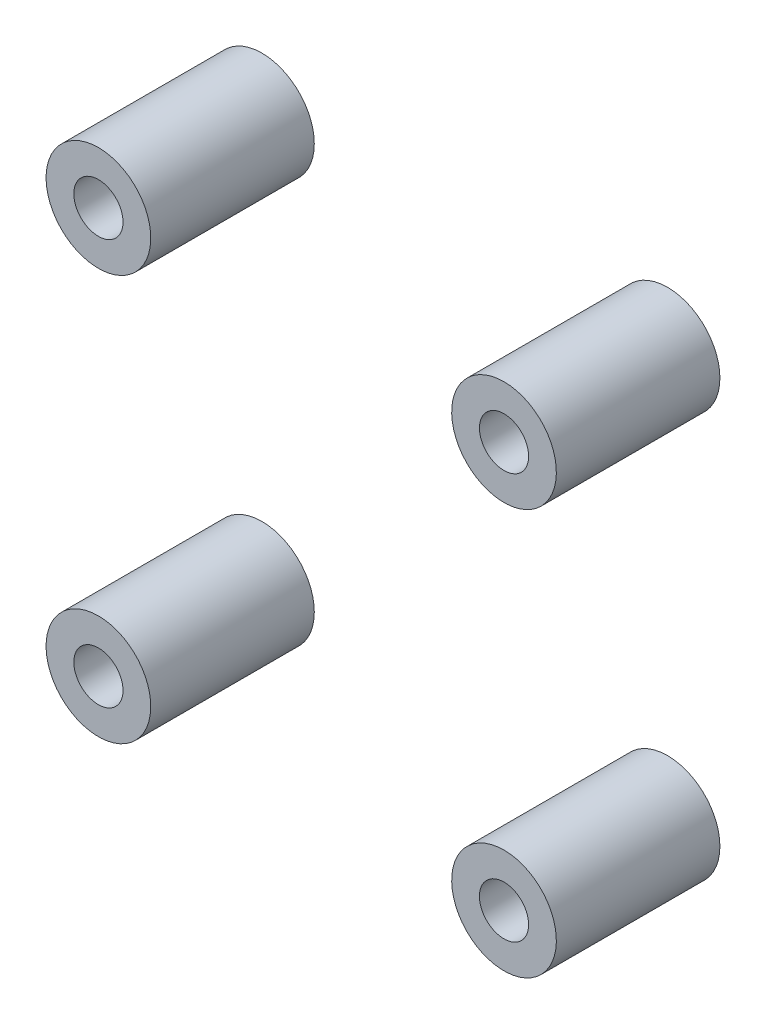
ISO-10303-21;
HEADER;
FILE_DESCRIPTION(('STEP AP214'),'2;1');
FILE_NAME('part.step','',(''),(''),'','','');
FILE_SCHEMA(('AUTOMOTIVE_DESIGN { 1 0 10303 214 1 1 1 1 }'));
ENDSEC;
DATA;
#1=APPLICATION_CONTEXT('core data for automotive mechanical design processes');
#2=APPLICATION_PROTOCOL_DEFINITION('international standard','automotive_design',2000,#1);
#3=PRODUCT_CONTEXT('',#1,'mechanical');
#4=PRODUCT('Part','Part','',(#3));
#5=PRODUCT_RELATED_PRODUCT_CATEGORY('part','',(#4));
#6=PRODUCT_DEFINITION_FORMATION('','',#4);
#7=PRODUCT_DEFINITION_CONTEXT('part definition',#1,'design');
#8=PRODUCT_DEFINITION('design','',#6,#7);
#9=PRODUCT_DEFINITION_SHAPE('','',#8);
#10=(LENGTH_UNIT() NAMED_UNIT(*) SI_UNIT(.MILLI.,.METRE.));
#11=(NAMED_UNIT(*) PLANE_ANGLE_UNIT() SI_UNIT($,.RADIAN.));
#12=(NAMED_UNIT(*) SI_UNIT($,.STERADIAN.) SOLID_ANGLE_UNIT());
#13=UNCERTAINTY_MEASURE_WITH_UNIT(LENGTH_MEASURE(1.E-05),#10,'distance_accuracy_value','');
#14=(GEOMETRIC_REPRESENTATION_CONTEXT(3) GLOBAL_UNCERTAINTY_ASSIGNED_CONTEXT((#13)) GLOBAL_UNIT_ASSIGNED_CONTEXT((#10,
#11,#12)) REPRESENTATION_CONTEXT('',''));
#15=CARTESIAN_POINT('',(0.,0.,0.));
#16=DIRECTION('',(0.,0.,1.));
#17=DIRECTION('',(1.,0.,0.));
#18=AXIS2_PLACEMENT_3D('',#15,#16,#17);
#19=CARTESIAN_POINT('',(-15.4999999999632,15.4999999998757,0.));
#20=DIRECTION('',(0.,0.,1.));
#21=DIRECTION('',(1.,0.,0.));
#22=AXIS2_PLACEMENT_3D('',#19,#20,#21);
#23=PLANE('',#22);
#24=CARTESIAN_POINT('',(-15.4999999999632,15.4999999998757,0.));
#25=DIRECTION('',(0.,0.,1.));
#26=DIRECTION('',(1.,0.,0.));
#27=AXIS2_PLACEMENT_3D('',#24,#25,#26);
#28=CIRCLE('',#27,4.00000000000092);
#29=CARTESIAN_POINT('',(-11.4999999999623,15.4999999998757,0.));
#30=VERTEX_POINT('',#29);
#31=EDGE_CURVE('E48',#30,#30,#28,.T.);
#32=ORIENTED_EDGE('',*,*,#31,.F.);
#33=EDGE_LOOP('',(#32));
#34=FACE_BOUND('',#33,.T.);
#35=CARTESIAN_POINT('',(-15.4999999999632,15.4999999998757,0.));
#36=DIRECTION('',(0.,0.,1.));
#37=DIRECTION('',(1.,0.,0.));
#38=AXIS2_PLACEMENT_3D('',#35,#36,#37);
#39=CIRCLE('',#38,1.88000000000093);
#40=CARTESIAN_POINT('',(-13.6199999999623,15.4999999998757,0.));
#41=VERTEX_POINT('',#40);
#42=EDGE_CURVE('E11',#41,#41,#39,.T.);
#43=ORIENTED_EDGE('',*,*,#42,.T.);
#44=EDGE_LOOP('',(#43));
#45=FACE_BOUND('',#44,.T.);
#46=ADVANCED_FACE('F45',(#34,#45),#23,.F.);
#47=CARTESIAN_POINT('',(-15.4999999999632,15.4999999998757,23.8137084989872));
#48=DIRECTION('',(0.,0.,-1.));
#49=DIRECTION('',(-1.,0.,0.));
#50=AXIS2_PLACEMENT_3D('',#47,#48,#49);
#51=CYLINDRICAL_SURFACE('',#50,4.00000000000092);
#52=CARTESIAN_POINT('',(-15.4999999999632,15.4999999998757,12.4999999999998));
#53=DIRECTION('',(0.,0.,-1.));
#54=DIRECTION('',(0.,1.,0.));
#55=AXIS2_PLACEMENT_3D('',#52,#53,#54);
#56=CIRCLE('',#55,4.00000000000092);
#57=CARTESIAN_POINT('',(-15.4999999999632,19.4999999998766,12.4999999999998));
#58=VERTEX_POINT('',#57);
#59=EDGE_CURVE('E52',#58,#58,#56,.T.);
#60=ORIENTED_EDGE('',*,*,#59,.T.);
#61=EDGE_LOOP('',(#60));
#62=FACE_BOUND('',#61,.T.);
#63=ORIENTED_EDGE('',*,*,#31,.T.);
#64=EDGE_LOOP('',(#63));
#65=FACE_BOUND('',#64,.T.);
#66=ADVANCED_FACE('F65',(#62,#65),#51,.T.);
#67=CARTESIAN_POINT('',(-15.4999999999632,15.4999999998757,23.8137084989872));
#68=DIRECTION('',(0.,0.,-1.));
#69=DIRECTION('',(-1.,0.,0.));
#70=AXIS2_PLACEMENT_3D('',#67,#68,#69);
#71=CYLINDRICAL_SURFACE('',#70,1.88000000000093);
#72=CARTESIAN_POINT('',(-15.4999999999632,15.4999999998757,12.4999999999998));
#73=DIRECTION('',(0.,0.,-1.));
#74=DIRECTION('',(0.,1.,0.));
#75=AXIS2_PLACEMENT_3D('',#72,#73,#74);
#76=CIRCLE('',#75,1.88000000000093);
#77=CARTESIAN_POINT('',(-15.4999999999632,17.3799999998766,12.4999999999998));
#78=VERTEX_POINT('',#77);
#79=EDGE_CURVE('E58',#78,#78,#76,.T.);
#80=ORIENTED_EDGE('',*,*,#79,.F.);
#81=EDGE_LOOP('',(#80));
#82=FACE_BOUND('',#81,.T.);
#83=ORIENTED_EDGE('',*,*,#42,.F.);
#84=EDGE_LOOP('',(#83));
#85=FACE_BOUND('',#84,.T.);
#86=ADVANCED_FACE('F71',(#82,#85),#71,.F.);
#87=CARTESIAN_POINT('',(-68.680694001548,-0.40072094139415,12.4999999999998));
#88=DIRECTION('',(0.,0.,-1.));
#89=DIRECTION('',(1.,2.81912779027103E-12,0.));
#90=AXIS2_PLACEMENT_3D('',#87,#88,#89);
#91=PLANE('',#90);
#92=ORIENTED_EDGE('',*,*,#79,.T.);
#93=EDGE_LOOP('',(#92));
#94=FACE_BOUND('',#93,.T.);
#95=ORIENTED_EDGE('',*,*,#59,.F.);
#96=EDGE_LOOP('',(#95));
#97=FACE_BOUND('',#96,.T.);
#98=ADVANCED_FACE('F76',(#94,#97),#91,.F.);
#99=CLOSED_SHELL('',(#46,#66,#86,#98));
#100=MANIFOLD_SOLID_BREP('B2',#99);
#101=CARTESIAN_POINT('',(-15.4999999998757,-15.4999999999641,0.));
#102=DIRECTION('',(0.,0.,1.));
#103=DIRECTION('',(1.,0.,0.));
#104=AXIS2_PLACEMENT_3D('',#101,#102,#103);
#105=PLANE('',#104);
#106=CARTESIAN_POINT('',(-15.4999999998757,-15.4999999999641,0.));
#107=DIRECTION('',(0.,0.,1.));
#108=DIRECTION('',(1.,0.,0.));
#109=AXIS2_PLACEMENT_3D('',#106,#107,#108);
#110=CIRCLE('',#109,4.00000000000064);
#111=CARTESIAN_POINT('',(-11.499999999875,-15.4999999999641,0.));
#112=VERTEX_POINT('',#111);
#113=EDGE_CURVE('E125',#112,#112,#110,.T.);
#114=ORIENTED_EDGE('',*,*,#113,.F.);
#115=EDGE_LOOP('',(#114));
#116=FACE_BOUND('',#115,.T.);
#117=CARTESIAN_POINT('',(-15.4999999998757,-15.4999999999641,0.));
#118=DIRECTION('',(0.,0.,1.));
#119=DIRECTION('',(1.,0.,0.));
#120=AXIS2_PLACEMENT_3D('',#117,#118,#119);
#121=CIRCLE('',#120,1.88000000000064);
#122=CARTESIAN_POINT('',(-13.619999999875,-15.4999999999641,0.));
#123=VERTEX_POINT('',#122);
#124=EDGE_CURVE('E44',#123,#123,#121,.T.);
#125=ORIENTED_EDGE('',*,*,#124,.T.);
#126=EDGE_LOOP('',(#125));
#127=FACE_BOUND('',#126,.T.);
#128=ADVANCED_FACE('F122',(#116,#127),#105,.F.);
#129=CARTESIAN_POINT('',(-15.4999999998757,-15.4999999999641,23.8137084989872));
#130=DIRECTION('',(0.,0.,-1.));
#131=DIRECTION('',(-1.,0.,0.));
#132=AXIS2_PLACEMENT_3D('',#129,#130,#131);
#133=CYLINDRICAL_SURFACE('',#132,4.00000000000064);
#134=CARTESIAN_POINT('',(-15.4999999998757,-15.4999999999641,12.4999999999999));
#135=DIRECTION('',(0.,0.,-1.));
#136=DIRECTION('',(0.,1.,0.));
#137=AXIS2_PLACEMENT_3D('',#134,#135,#136);
#138=CIRCLE('',#137,4.00000000000064);
#139=CARTESIAN_POINT('',(-15.4999999998757,-11.4999999999634,12.4999999999999));
#140=VERTEX_POINT('',#139);
#141=EDGE_CURVE('E129',#140,#140,#138,.T.);
#142=ORIENTED_EDGE('',*,*,#141,.T.);
#143=EDGE_LOOP('',(#142));
#144=FACE_BOUND('',#143,.T.);
#145=ORIENTED_EDGE('',*,*,#113,.T.);
#146=EDGE_LOOP('',(#145));
#147=FACE_BOUND('',#146,.T.);
#148=ADVANCED_FACE('F142',(#144,#147),#133,.T.);
#149=CARTESIAN_POINT('',(-15.4999999998757,-15.4999999999641,23.8137084989872));
#150=DIRECTION('',(0.,0.,-1.));
#151=DIRECTION('',(-1.,0.,0.));
#152=AXIS2_PLACEMENT_3D('',#149,#150,#151);
#153=CYLINDRICAL_SURFACE('',#152,1.88000000000064);
#154=CARTESIAN_POINT('',(-15.4999999998757,-15.4999999999641,12.4999999999999));
#155=DIRECTION('',(0.,0.,-1.));
#156=DIRECTION('',(0.,1.,0.));
#157=AXIS2_PLACEMENT_3D('',#154,#155,#156);
#158=CIRCLE('',#157,1.88000000000064);
#159=CARTESIAN_POINT('',(-15.4999999998757,-13.6199999999634,12.4999999999999));
#160=VERTEX_POINT('',#159);
#161=EDGE_CURVE('E135',#160,#160,#158,.T.);
#162=ORIENTED_EDGE('',*,*,#161,.F.);
#163=EDGE_LOOP('',(#162));
#164=FACE_BOUND('',#163,.T.);
#165=ORIENTED_EDGE('',*,*,#124,.F.);
#166=EDGE_LOOP('',(#165));
#167=FACE_BOUND('',#166,.T.);
#168=ADVANCED_FACE('F148',(#164,#167),#153,.F.);
#169=CARTESIAN_POINT('',(-68.680694001548,-0.40072094139415,12.4999999999998));
#170=DIRECTION('',(0.,0.,-1.));
#171=DIRECTION('',(1.,2.81912779027103E-12,0.));
#172=AXIS2_PLACEMENT_3D('',#169,#170,#171);
#173=PLANE('',#172);
#174=ORIENTED_EDGE('',*,*,#161,.T.);
#175=EDGE_LOOP('',(#174));
#176=FACE_BOUND('',#175,.T.);
#177=ORIENTED_EDGE('',*,*,#141,.F.);
#178=EDGE_LOOP('',(#177));
#179=FACE_BOUND('',#178,.T.);
#180=ADVANCED_FACE('F153',(#176,#179),#173,.F.);
#181=CLOSED_SHELL('',(#128,#148,#168,#180));
#182=MANIFOLD_SOLID_BREP('B6',#181);
#183=CARTESIAN_POINT('',(15.4999999999641,-15.4999999998765,0.));
#184=DIRECTION('',(0.,0.,1.));
#185=DIRECTION('',(1.,0.,0.));
#186=AXIS2_PLACEMENT_3D('',#183,#184,#185);
#187=PLANE('',#186);
#188=CARTESIAN_POINT('',(15.4999999999641,-15.4999999998765,0.));
#189=DIRECTION('',(0.,0.,1.));
#190=DIRECTION('',(1.,0.,0.));
#191=AXIS2_PLACEMENT_3D('',#188,#189,#190);
#192=CIRCLE('',#191,3.99999999999979);
#193=CARTESIAN_POINT('',(19.4999999999639,-15.4999999998765,0.));
#194=VERTEX_POINT('',#193);
#195=EDGE_CURVE('E201',#194,#194,#192,.T.);
#196=ORIENTED_EDGE('',*,*,#195,.F.);
#197=EDGE_LOOP('',(#196));
#198=FACE_BOUND('',#197,.T.);
#199=CARTESIAN_POINT('',(15.4999999999641,-15.4999999998765,0.));
#200=DIRECTION('',(0.,0.,1.));
#201=DIRECTION('',(1.,0.,0.));
#202=AXIS2_PLACEMENT_3D('',#199,#200,#201);
#203=CIRCLE('',#202,1.87999999999979);
#204=CARTESIAN_POINT('',(17.3799999999639,-15.4999999998765,0.));
#205=VERTEX_POINT('',#204);
#206=EDGE_CURVE('E121',#205,#205,#203,.T.);
#207=ORIENTED_EDGE('',*,*,#206,.T.);
#208=EDGE_LOOP('',(#207));
#209=FACE_BOUND('',#208,.T.);
#210=ADVANCED_FACE('F198',(#198,#209),#187,.F.);
#211=CARTESIAN_POINT('',(15.4999999999641,-15.4999999998765,23.8137084989872));
#212=DIRECTION('',(0.,0.,-1.));
#213=DIRECTION('',(-1.,0.,0.));
#214=AXIS2_PLACEMENT_3D('',#211,#212,#213);
#215=CYLINDRICAL_SURFACE('',#214,3.99999999999979);
#216=CARTESIAN_POINT('',(15.4999999999641,-15.4999999998765,12.4999999999999));
#217=DIRECTION('',(0.,0.,-1.));
#218=DIRECTION('',(0.,1.,0.));
#219=AXIS2_PLACEMENT_3D('',#216,#217,#218);
#220=CIRCLE('',#219,3.99999999999979);
#221=CARTESIAN_POINT('',(15.4999999999641,-11.4999999998768,12.4999999999999));
#222=VERTEX_POINT('',#221);
#223=EDGE_CURVE('E205',#222,#222,#220,.T.);
#224=ORIENTED_EDGE('',*,*,#223,.T.);
#225=EDGE_LOOP('',(#224));
#226=FACE_BOUND('',#225,.T.);
#227=ORIENTED_EDGE('',*,*,#195,.T.);
#228=EDGE_LOOP('',(#227));
#229=FACE_BOUND('',#228,.T.);
#230=ADVANCED_FACE('F218',(#226,#229),#215,.T.);
#231=CARTESIAN_POINT('',(15.4999999999641,-15.4999999998765,23.8137084989872));
#232=DIRECTION('',(0.,0.,-1.));
#233=DIRECTION('',(-1.,0.,0.));
#234=AXIS2_PLACEMENT_3D('',#231,#232,#233);
#235=CYLINDRICAL_SURFACE('',#234,1.87999999999979);
#236=CARTESIAN_POINT('',(15.4999999999641,-15.4999999998765,12.4999999999999));
#237=DIRECTION('',(0.,0.,-1.));
#238=DIRECTION('',(0.,1.,0.));
#239=AXIS2_PLACEMENT_3D('',#236,#237,#238);
#240=CIRCLE('',#239,1.87999999999979);
#241=CARTESIAN_POINT('',(15.4999999999641,-13.6199999998767,12.4999999999999));
#242=VERTEX_POINT('',#241);
#243=EDGE_CURVE('E211',#242,#242,#240,.T.);
#244=ORIENTED_EDGE('',*,*,#243,.F.);
#245=EDGE_LOOP('',(#244));
#246=FACE_BOUND('',#245,.T.);
#247=ORIENTED_EDGE('',*,*,#206,.F.);
#248=EDGE_LOOP('',(#247));
#249=FACE_BOUND('',#248,.T.);
#250=ADVANCED_FACE('F224',(#246,#249),#235,.F.);
#251=CARTESIAN_POINT('',(-68.680694001548,-0.40072094139415,12.4999999999998));
#252=DIRECTION('',(0.,0.,-1.));
#253=DIRECTION('',(1.,2.81912779027103E-12,0.));
#254=AXIS2_PLACEMENT_3D('',#251,#252,#253);
#255=PLANE('',#254);
#256=ORIENTED_EDGE('',*,*,#243,.T.);
#257=EDGE_LOOP('',(#256));
#258=FACE_BOUND('',#257,.T.);
#259=ORIENTED_EDGE('',*,*,#223,.F.);
#260=EDGE_LOOP('',(#259));
#261=FACE_BOUND('',#260,.T.);
#262=ADVANCED_FACE('F229',(#258,#261),#255,.F.);
#263=CLOSED_SHELL('',(#210,#230,#250,#262));
#264=MANIFOLD_SOLID_BREP('B39',#263);
#265=CARTESIAN_POINT('',(15.4999999998765,15.4999999999632,0.));
#266=DIRECTION('',(0.,0.,1.));
#267=DIRECTION('',(1.,0.,0.));
#268=AXIS2_PLACEMENT_3D('',#265,#266,#267);
#269=PLANE('',#268);
#270=CARTESIAN_POINT('',(15.4999999998765,15.4999999999632,0.));
#271=DIRECTION('',(0.,0.,1.));
#272=DIRECTION('',(1.,0.,0.));
#273=AXIS2_PLACEMENT_3D('',#270,#271,#272);
#274=CIRCLE('',#273,4.);
#275=CARTESIAN_POINT('',(19.4999999998765,15.4999999999632,0.));
#276=VERTEX_POINT('',#275);
#277=EDGE_CURVE('E274',#276,#276,#274,.T.);
#278=ORIENTED_EDGE('',*,*,#277,.F.);
#279=EDGE_LOOP('',(#278));
#280=FACE_BOUND('',#279,.T.);
#281=CARTESIAN_POINT('',(15.4999999998765,15.4999999999632,0.));
#282=DIRECTION('',(0.,0.,1.));
#283=DIRECTION('',(1.,0.,0.));
#284=AXIS2_PLACEMENT_3D('',#281,#282,#283);
#285=CIRCLE('',#284,1.88);
#286=CARTESIAN_POINT('',(17.3799999998765,15.4999999999632,0.));
#287=VERTEX_POINT('',#286);
#288=EDGE_CURVE('E283',#287,#287,#285,.T.);
#289=ORIENTED_EDGE('',*,*,#288,.T.);
#290=EDGE_LOOP('',(#289));
#291=FACE_BOUND('',#290,.T.);
#292=ADVANCED_FACE('F267',(#280,#291),#269,.F.);
#293=CARTESIAN_POINT('',(15.4999999998765,15.4999999999632,23.8137084989872));
#294=DIRECTION('',(0.,0.,-1.));
#295=DIRECTION('',(-1.,0.,0.));
#296=AXIS2_PLACEMENT_3D('',#293,#294,#295);
#297=CYLINDRICAL_SURFACE('',#296,4.);
#298=CARTESIAN_POINT('',(15.4999999998765,15.4999999999632,12.4999999999999));
#299=DIRECTION('',(0.,0.,-1.));
#300=DIRECTION('',(0.,1.,0.));
#301=AXIS2_PLACEMENT_3D('',#298,#299,#300);
#302=CIRCLE('',#301,4.);
#303=CARTESIAN_POINT('',(15.4999999998765,19.4999999999632,12.4999999999999));
#304=VERTEX_POINT('',#303);
#305=EDGE_CURVE('E278',#304,#304,#302,.T.);
#306=ORIENTED_EDGE('',*,*,#305,.T.);
#307=EDGE_LOOP('',(#306));
#308=FACE_BOUND('',#307,.T.);
#309=ORIENTED_EDGE('',*,*,#277,.T.);
#310=EDGE_LOOP('',(#309));
#311=FACE_BOUND('',#310,.T.);
#312=ADVANCED_FACE('F291',(#308,#311),#297,.T.);
#313=CARTESIAN_POINT('',(15.4999999998765,15.4999999999632,23.8137084989872));
#314=DIRECTION('',(0.,0.,-1.));
#315=DIRECTION('',(-1.,0.,0.));
#316=AXIS2_PLACEMENT_3D('',#313,#314,#315);
#317=CYLINDRICAL_SURFACE('',#316,1.88);
#318=CARTESIAN_POINT('',(15.4999999998765,15.4999999999632,12.4999999999999));
#319=DIRECTION('',(0.,0.,-1.));
#320=DIRECTION('',(0.,1.,0.));
#321=AXIS2_PLACEMENT_3D('',#318,#319,#320);
#322=CIRCLE('',#321,1.88);
#323=CARTESIAN_POINT('',(15.4999999998765,17.3799999999632,12.4999999999999));
#324=VERTEX_POINT('',#323);
#325=EDGE_CURVE('E197',#324,#324,#322,.T.);
#326=ORIENTED_EDGE('',*,*,#325,.F.);
#327=EDGE_LOOP('',(#326));
#328=FACE_BOUND('',#327,.T.);
#329=ORIENTED_EDGE('',*,*,#288,.F.);
#330=EDGE_LOOP('',(#329));
#331=FACE_BOUND('',#330,.T.);
#332=ADVANCED_FACE('F289',(#328,#331),#317,.F.);
#333=CARTESIAN_POINT('',(-68.680694001548,-0.40072094139415,12.4999999999998));
#334=DIRECTION('',(0.,0.,-1.));
#335=DIRECTION('',(1.,2.81912779027103E-12,0.));
#336=AXIS2_PLACEMENT_3D('',#333,#334,#335);
#337=PLANE('',#336);
#338=ORIENTED_EDGE('',*,*,#325,.T.);
#339=EDGE_LOOP('',(#338));
#340=FACE_BOUND('',#339,.T.);
#341=ORIENTED_EDGE('',*,*,#305,.F.);
#342=EDGE_LOOP('',(#341));
#343=FACE_BOUND('',#342,.T.);
#344=ADVANCED_FACE('F269',(#340,#343),#337,.F.);
#345=CLOSED_SHELL('',(#292,#312,#332,#344));
#346=MANIFOLD_SOLID_BREP('B116',#345);
#347=ADVANCED_BREP_SHAPE_REPRESENTATION('',(#18,#100,#182,#264,#346),#14);
#348=SHAPE_DEFINITION_REPRESENTATION(#9,#347);
ENDSEC;
END-ISO-10303-21;
